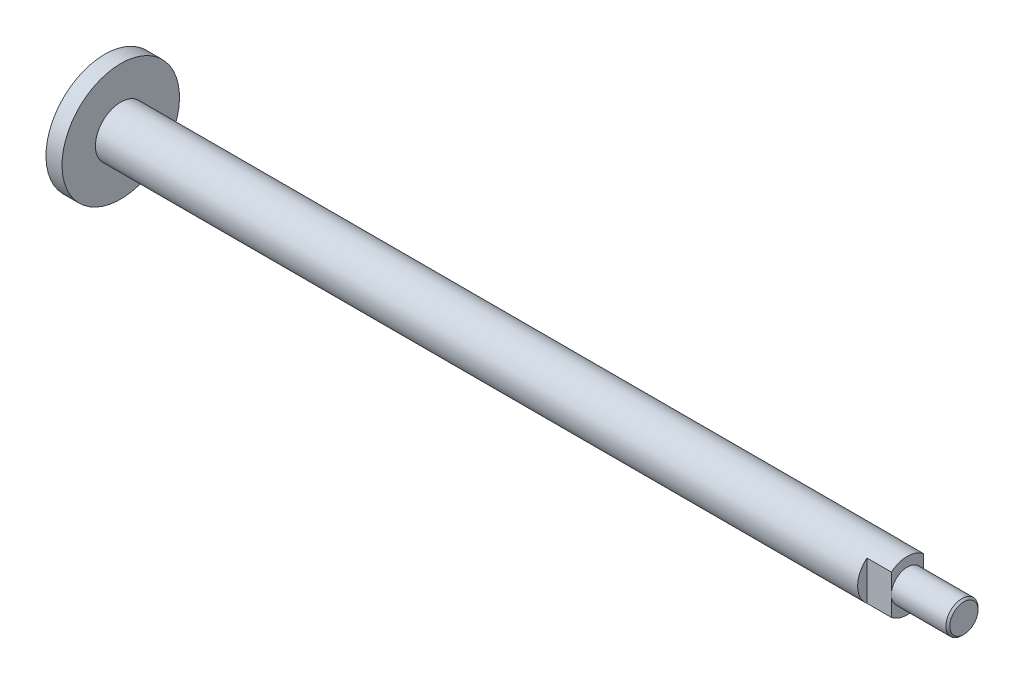
ISO-10303-21;
HEADER;
FILE_DESCRIPTION(('STEP AP214'),'2;1');
FILE_NAME('part.step','',(''),(''),'','','');
FILE_SCHEMA(('AUTOMOTIVE_DESIGN { 1 0 10303 214 1 1 1 1 }'));
ENDSEC;
DATA;
#1=APPLICATION_CONTEXT('core data for automotive mechanical design processes');
#2=APPLICATION_PROTOCOL_DEFINITION('international standard','automotive_design',2000,#1);
#3=PRODUCT_CONTEXT('',#1,'mechanical');
#4=PRODUCT('Part','Part','',(#3));
#5=PRODUCT_RELATED_PRODUCT_CATEGORY('part','',(#4));
#6=PRODUCT_DEFINITION_FORMATION('','',#4);
#7=PRODUCT_DEFINITION_CONTEXT('part definition',#1,'design');
#8=PRODUCT_DEFINITION('design','',#6,#7);
#9=PRODUCT_DEFINITION_SHAPE('','',#8);
#10=(LENGTH_UNIT() NAMED_UNIT(*) SI_UNIT(.MILLI.,.METRE.));
#11=(NAMED_UNIT(*) PLANE_ANGLE_UNIT() SI_UNIT($,.RADIAN.));
#12=(NAMED_UNIT(*) SI_UNIT($,.STERADIAN.) SOLID_ANGLE_UNIT());
#13=UNCERTAINTY_MEASURE_WITH_UNIT(LENGTH_MEASURE(1.E-05),#10,'distance_accuracy_value','');
#14=(GEOMETRIC_REPRESENTATION_CONTEXT(3) GLOBAL_UNCERTAINTY_ASSIGNED_CONTEXT((#13)) GLOBAL_UNIT_ASSIGNED_CONTEXT((#10,
#11,#12)) REPRESENTATION_CONTEXT('',''));
#15=CARTESIAN_POINT('',(0.,0.,0.));
#16=DIRECTION('',(0.,0.,1.));
#17=DIRECTION('',(1.,0.,0.));
#18=AXIS2_PLACEMENT_3D('',#15,#16,#17);
#19=CARTESIAN_POINT('',(317.627,6.35,0.));
#20=DIRECTION('',(-1.,0.,0.));
#21=DIRECTION('',(0.,0.,1.));
#22=AXIS2_PLACEMENT_3D('',#19,#20,#21);
#23=PLANE('',#22);
#24=CARTESIAN_POINT('',(317.627,0.,0.));
#25=DIRECTION('',(-1.,0.,0.));
#26=DIRECTION('',(0.,0.,1.));
#27=AXIS2_PLACEMENT_3D('',#24,#25,#26);
#28=CIRCLE('',#27,10.033);
#29=CARTESIAN_POINT('',(317.627,7.76779177115346,6.35));
#30=VERTEX_POINT('',#29);
#31=CARTESIAN_POINT('',(317.627,7.76779177115345,-6.35));
#32=VERTEX_POINT('',#31);
#33=EDGE_CURVE('E149',#30,#32,#28,.T.);
#34=ORIENTED_EDGE('',*,*,#33,.F.);
#35=DIRECTION('',(0.,-1.,0.));
#36=VECTOR('',#35,1.);
#37=CARTESIAN_POINT('',(317.627,6.35,6.35));
#38=LINE('',#37,#36);
#39=CARTESIAN_POINT('',(317.627,0.,6.35));
#40=VERTEX_POINT('',#39);
#41=EDGE_CURVE('E140',#30,#40,#38,.T.);
#42=ORIENTED_EDGE('',*,*,#41,.T.);
#43=CARTESIAN_POINT('',(317.627,0.,0.));
#44=DIRECTION('',(-1.,0.,0.));
#45=DIRECTION('',(0.,0.,1.));
#46=AXIS2_PLACEMENT_3D('',#43,#44,#45);
#47=CIRCLE('',#46,6.35);
#48=CARTESIAN_POINT('',(317.627,0.,-6.35));
#49=VERTEX_POINT('',#48);
#50=EDGE_CURVE('E154',#40,#49,#47,.T.);
#51=ORIENTED_EDGE('',*,*,#50,.T.);
#52=DIRECTION('',(0.,1.,0.));
#53=VECTOR('',#52,1.);
#54=CARTESIAN_POINT('',(317.627,6.35,-6.35));
#55=LINE('',#54,#53);
#56=EDGE_CURVE('E120',#49,#32,#55,.T.);
#57=ORIENTED_EDGE('',*,*,#56,.T.);
#58=EDGE_LOOP('',(#34,#42,#51,#57));
#59=FACE_BOUND('',#58,.T.);
#60=ADVANCED_FACE('F49',(#59),#23,.F.);
#61=CARTESIAN_POINT('',(0.,0.,0.));
#62=DIRECTION('',(-1.,0.,0.));
#63=DIRECTION('',(0.,-1.,0.));
#64=AXIS2_PLACEMENT_3D('',#61,#62,#63);
#65=PLANE('',#64);
#66=CARTESIAN_POINT('',(0.,0.,0.));
#67=DIRECTION('',(1.,0.,0.));
#68=DIRECTION('',(0.,1.,0.));
#69=AXIS2_PLACEMENT_3D('',#66,#67,#68);
#70=CIRCLE('',#69,23.241);
#71=CARTESIAN_POINT('',(0.,23.241,0.));
#72=VERTEX_POINT('',#71);
#73=EDGE_CURVE('E12',#72,#72,#70,.T.);
#74=ORIENTED_EDGE('',*,*,#73,.F.);
#75=EDGE_LOOP('',(#74));
#76=FACE_BOUND('',#75,.T.);
#77=ADVANCED_FACE('F51',(#76),#65,.T.);
#78=CARTESIAN_POINT('',(339.979,0.,0.));
#79=DIRECTION('',(1.,0.,0.));
#80=DIRECTION('',(0.,1.,0.));
#81=AXIS2_PLACEMENT_3D('',#78,#79,#80);
#82=CYLINDRICAL_SURFACE('',#81,23.241);
#83=ORIENTED_EDGE('',*,*,#73,.T.);
#84=EDGE_LOOP('',(#83));
#85=FACE_BOUND('',#84,.T.);
#86=CARTESIAN_POINT('',(6.35000000000002,0.,0.));
#87=DIRECTION('',(1.,0.,0.));
#88=DIRECTION('',(0.,1.,0.));
#89=AXIS2_PLACEMENT_3D('',#86,#87,#88);
#90=CIRCLE('',#89,23.241);
#91=CARTESIAN_POINT('',(6.35000000000002,23.241,0.));
#92=VERTEX_POINT('',#91);
#93=EDGE_CURVE('E58',#92,#92,#90,.T.);
#94=ORIENTED_EDGE('',*,*,#93,.F.);
#95=EDGE_LOOP('',(#94));
#96=FACE_BOUND('',#95,.T.);
#97=ADVANCED_FACE('F168',(#85,#96),#82,.T.);
#98=CARTESIAN_POINT('',(6.35,23.241,0.));
#99=DIRECTION('',(1.,0.,0.));
#100=DIRECTION('',(0.,1.,0.));
#101=AXIS2_PLACEMENT_3D('',#98,#99,#100);
#102=PLANE('',#101);
#103=ORIENTED_EDGE('',*,*,#93,.T.);
#104=EDGE_LOOP('',(#103));
#105=FACE_BOUND('',#104,.T.);
#106=CARTESIAN_POINT('',(6.35000000000002,0.,0.));
#107=DIRECTION('',(1.,0.,0.));
#108=DIRECTION('',(0.,1.,0.));
#109=AXIS2_PLACEMENT_3D('',#106,#107,#108);
#110=CIRCLE('',#109,10.033);
#111=CARTESIAN_POINT('',(6.35000000000002,10.033,0.));
#112=VERTEX_POINT('',#111);
#113=EDGE_CURVE('E158',#112,#112,#110,.T.);
#114=ORIENTED_EDGE('',*,*,#113,.F.);
#115=EDGE_LOOP('',(#114));
#116=FACE_BOUND('',#115,.T.);
#117=ADVANCED_FACE('F165',(#105,#116),#102,.T.);
#118=CARTESIAN_POINT('',(339.979,0.,0.));
#119=DIRECTION('',(1.,0.,0.));
#120=DIRECTION('',(0.,1.,0.));
#121=AXIS2_PLACEMENT_3D('',#118,#119,#120);
#122=CYLINDRICAL_SURFACE('',#121,10.033);
#123=DIRECTION('',(1.,0.,0.));
#124=VECTOR('',#123,1.);
#125=CARTESIAN_POINT('',(307.975,7.76779177115346,6.35));
#126=LINE('',#125,#124);
#127=CARTESIAN_POINT('',(307.975,7.76779177115346,6.35));
#128=VERTEX_POINT('',#127);
#129=EDGE_CURVE('E108',#128,#30,#126,.T.);
#130=ORIENTED_EDGE('',*,*,#129,.T.);
#131=ORIENTED_EDGE('',*,*,#33,.T.);
#132=DIRECTION('',(1.,0.,0.));
#133=VECTOR('',#132,1.);
#134=CARTESIAN_POINT('',(307.975,7.76779177115346,-6.35));
#135=LINE('',#134,#133);
#136=CARTESIAN_POINT('',(307.975,7.76779177115346,-6.35));
#137=VERTEX_POINT('',#136);
#138=EDGE_CURVE('E73',#137,#32,#135,.T.);
#139=ORIENTED_EDGE('',*,*,#138,.F.);
#140=CARTESIAN_POINT('',(307.975,0.,0.));
#141=DIRECTION('',(1.,0.,0.));
#142=DIRECTION('',(0.,0.,1.));
#143=AXIS2_PLACEMENT_3D('',#140,#141,#142);
#144=CIRCLE('',#143,10.033);
#145=CARTESIAN_POINT('',(307.975,-7.76779177115345,-6.35));
#146=VERTEX_POINT('',#145);
#147=EDGE_CURVE('E105',#146,#137,#144,.T.);
#148=ORIENTED_EDGE('',*,*,#147,.F.);
#149=DIRECTION('',(1.,0.,0.));
#150=VECTOR('',#149,1.);
#151=CARTESIAN_POINT('',(307.975,-7.76779177115345,-6.35));
#152=LINE('',#151,#150);
#153=CARTESIAN_POINT('',(317.627,-7.76779177115345,-6.35));
#154=VERTEX_POINT('',#153);
#155=EDGE_CURVE('E126',#146,#154,#152,.T.);
#156=ORIENTED_EDGE('',*,*,#155,.T.);
#157=CARTESIAN_POINT('',(317.627,-7.76779177115344,6.35));
#158=VERTEX_POINT('',#157);
#159=EDGE_CURVE('E116',#154,#158,#28,.T.);
#160=ORIENTED_EDGE('',*,*,#159,.T.);
#161=DIRECTION('',(1.,0.,0.));
#162=VECTOR('',#161,1.);
#163=CARTESIAN_POINT('',(307.975,-7.76779177115345,6.35));
#164=LINE('',#163,#162);
#165=CARTESIAN_POINT('',(307.975,-7.76779177115345,6.35));
#166=VERTEX_POINT('',#165);
#167=EDGE_CURVE('E65',#166,#158,#164,.T.);
#168=ORIENTED_EDGE('',*,*,#167,.F.);
#169=CARTESIAN_POINT('',(307.975,0.,0.));
#170=DIRECTION('',(1.,0.,0.));
#171=DIRECTION('',(0.,0.,1.));
#172=AXIS2_PLACEMENT_3D('',#169,#170,#171);
#173=CIRCLE('',#172,10.033);
#174=EDGE_CURVE('E99',#128,#166,#173,.T.);
#175=ORIENTED_EDGE('',*,*,#174,.F.);
#176=EDGE_LOOP('',(#130,#131,#139,#148,#156,#160,#168,#175));
#177=FACE_BOUND('',#176,.T.);
#178=ORIENTED_EDGE('',*,*,#113,.T.);
#179=EDGE_LOOP('',(#178));
#180=FACE_BOUND('',#179,.T.);
#181=ADVANCED_FACE('F112',(#177,#180),#122,.T.);
#182=CARTESIAN_POINT('',(339.979,0.,0.));
#183=DIRECTION('',(-1.,0.,0.));
#184=DIRECTION('',(0.,0.,1.));
#185=AXIS2_PLACEMENT_3D('',#182,#183,#184);
#186=CYLINDRICAL_SURFACE('',#185,6.35);
#187=ORIENTED_EDGE('',*,*,#50,.F.);
#188=EDGE_CURVE('E153',#49,#40,#47,.T.);
#189=ORIENTED_EDGE('',*,*,#188,.F.);
#190=EDGE_LOOP('',(#187,#189));
#191=FACE_BOUND('',#190,.T.);
#192=CARTESIAN_POINT('',(339.22335,0.,0.));
#193=DIRECTION('',(-1.,0.,0.));
#194=DIRECTION('',(0.,0.,1.));
#195=AXIS2_PLACEMENT_3D('',#192,#193,#194);
#196=CIRCLE('',#195,6.35);
#197=CARTESIAN_POINT('',(339.22335,0.,6.35));
#198=VERTEX_POINT('',#197);
#199=EDGE_CURVE('E141',#198,#198,#196,.T.);
#200=ORIENTED_EDGE('',*,*,#199,.T.);
#201=EDGE_LOOP('',(#200));
#202=FACE_BOUND('',#201,.T.);
#203=ADVANCED_FACE('F188',(#191,#202),#186,.T.);
#204=ORIENTED_EDGE('',*,*,#188,.T.);
#205=EDGE_CURVE('E137',#40,#158,#38,.T.);
#206=ORIENTED_EDGE('',*,*,#205,.T.);
#207=ORIENTED_EDGE('',*,*,#159,.F.);
#208=EDGE_CURVE('E136',#154,#49,#55,.T.);
#209=ORIENTED_EDGE('',*,*,#208,.T.);
#210=EDGE_LOOP('',(#204,#206,#207,#209));
#211=FACE_BOUND('',#210,.T.);
#212=ADVANCED_FACE('F180',(#211),#23,.F.);
#213=CARTESIAN_POINT('',(339.979,0.,0.));
#214=DIRECTION('',(-1.,0.,0.));
#215=DIRECTION('',(0.,0.,1.));
#216=AXIS2_PLACEMENT_3D('',#213,#214,#215);
#217=CONICAL_SURFACE('',#216,5.59435,0.78539816339745);
#218=ORIENTED_EDGE('',*,*,#199,.F.);
#219=EDGE_LOOP('',(#218));
#220=FACE_BOUND('',#219,.T.);
#221=CARTESIAN_POINT('',(339.979,0.,0.));
#222=DIRECTION('',(-1.,0.,0.));
#223=DIRECTION('',(0.,0.,1.));
#224=AXIS2_PLACEMENT_3D('',#221,#222,#223);
#225=CIRCLE('',#224,5.59435);
#226=CARTESIAN_POINT('',(339.979,0.,5.59435));
#227=VERTEX_POINT('',#226);
#228=EDGE_CURVE('E145',#227,#227,#225,.T.);
#229=ORIENTED_EDGE('',*,*,#228,.T.);
#230=EDGE_LOOP('',(#229));
#231=FACE_BOUND('',#230,.T.);
#232=ADVANCED_FACE('F187',(#220,#231),#217,.T.);
#233=CARTESIAN_POINT('',(339.979,10.033,0.));
#234=DIRECTION('',(1.,0.,0.));
#235=DIRECTION('',(0.,1.,0.));
#236=AXIS2_PLACEMENT_3D('',#233,#234,#235);
#237=PLANE('',#236);
#238=ORIENTED_EDGE('',*,*,#228,.F.);
#239=EDGE_LOOP('',(#238));
#240=FACE_BOUND('',#239,.T.);
#241=ADVANCED_FACE('F194',(#240),#237,.T.);
#242=CARTESIAN_POINT('',(307.975,7.76779177115346,-6.35));
#243=DIRECTION('',(0.,0.,1.));
#244=DIRECTION('',(1.,0.,0.));
#245=AXIS2_PLACEMENT_3D('',#242,#243,#244);
#246=PLANE('',#245);
#247=ORIENTED_EDGE('',*,*,#155,.F.);
#248=DIRECTION('',(0.,-1.,0.));
#249=VECTOR('',#248,1.);
#250=CARTESIAN_POINT('',(307.975,7.76779177115346,-6.35));
#251=LINE('',#250,#249);
#252=EDGE_CURVE('E125',#137,#146,#251,.T.);
#253=ORIENTED_EDGE('',*,*,#252,.F.);
#254=ORIENTED_EDGE('',*,*,#138,.T.);
#255=ORIENTED_EDGE('',*,*,#56,.F.);
#256=ORIENTED_EDGE('',*,*,#208,.F.);
#257=EDGE_LOOP('',(#247,#253,#254,#255,#256));
#258=FACE_BOUND('',#257,.T.);
#259=ADVANCED_FACE('F210',(#258),#246,.F.);
#260=CARTESIAN_POINT('',(307.975,0.,0.));
#261=DIRECTION('',(-1.,0.,0.));
#262=DIRECTION('',(0.,0.,1.));
#263=AXIS2_PLACEMENT_3D('',#260,#261,#262);
#264=PLANE('',#263);
#265=ORIENTED_EDGE('',*,*,#147,.T.);
#266=ORIENTED_EDGE('',*,*,#252,.T.);
#267=EDGE_LOOP('',(#265,#266));
#268=FACE_BOUND('',#267,.T.);
#269=ADVANCED_FACE('F209',(#268),#264,.F.);
#270=CARTESIAN_POINT('',(307.975,7.76779177115346,6.35));
#271=DIRECTION('',(0.,0.,-1.));
#272=DIRECTION('',(-1.,0.,0.));
#273=AXIS2_PLACEMENT_3D('',#270,#271,#272);
#274=PLANE('',#273);
#275=ORIENTED_EDGE('',*,*,#129,.F.);
#276=DIRECTION('',(0.,1.,0.));
#277=VECTOR('',#276,1.);
#278=CARTESIAN_POINT('',(307.975,7.76779177115346,6.35));
#279=LINE('',#278,#277);
#280=EDGE_CURVE('E101',#166,#128,#279,.T.);
#281=ORIENTED_EDGE('',*,*,#280,.F.);
#282=ORIENTED_EDGE('',*,*,#167,.T.);
#283=ORIENTED_EDGE('',*,*,#205,.F.);
#284=ORIENTED_EDGE('',*,*,#41,.F.);
#285=EDGE_LOOP('',(#275,#281,#282,#283,#284));
#286=FACE_BOUND('',#285,.T.);
#287=ADVANCED_FACE('F107',(#286),#274,.F.);
#288=CARTESIAN_POINT('',(307.975,0.,0.));
#289=DIRECTION('',(-1.,0.,0.));
#290=DIRECTION('',(0.,0.,1.));
#291=AXIS2_PLACEMENT_3D('',#288,#289,#290);
#292=PLANE('',#291);
#293=ORIENTED_EDGE('',*,*,#174,.T.);
#294=ORIENTED_EDGE('',*,*,#280,.T.);
#295=EDGE_LOOP('',(#293,#294));
#296=FACE_BOUND('',#295,.T.);
#297=ADVANCED_FACE('F100',(#296),#292,.F.);
#298=CLOSED_SHELL('',(#60,#77,#97,#117,#181,#203,#212,#232,#241,#259,#269,#287,#297));
#299=MANIFOLD_SOLID_BREP('B2',#298);
#300=ADVANCED_BREP_SHAPE_REPRESENTATION('',(#18,#299),#14);
#301=SHAPE_DEFINITION_REPRESENTATION(#9,#300);
ENDSEC;
END-ISO-10303-21;
